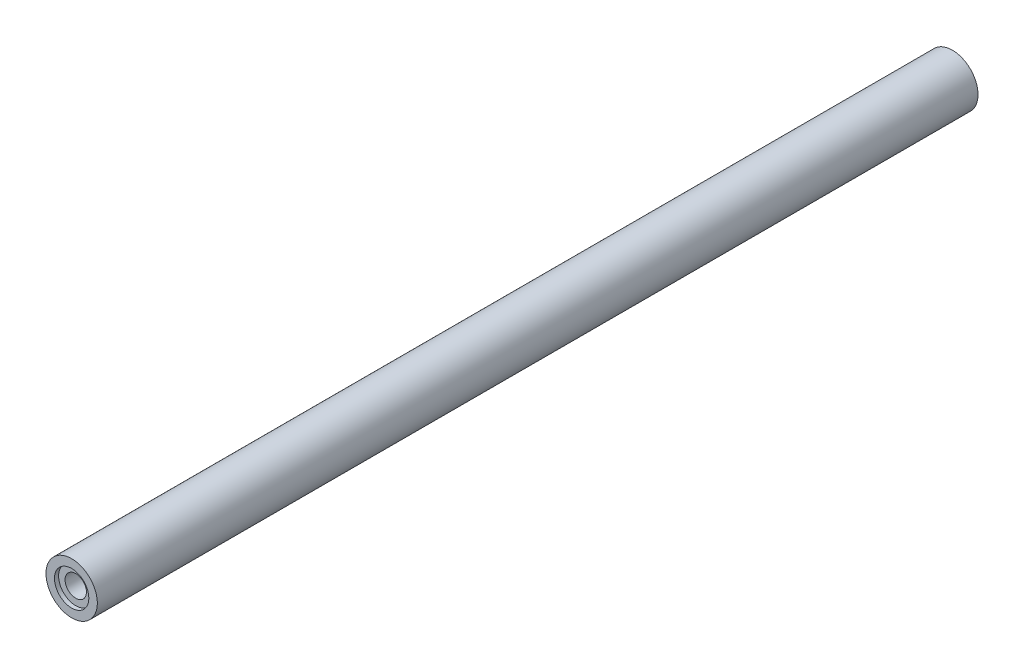
ISO-10303-21;
HEADER;
FILE_DESCRIPTION(('STEP AP214'),'2;1');
FILE_NAME('part.step','',(''),(''),'','','');
FILE_SCHEMA(('AUTOMOTIVE_DESIGN { 1 0 10303 214 1 1 1 1 }'));
ENDSEC;
DATA;
#1=APPLICATION_CONTEXT('core data for automotive mechanical design processes');
#2=APPLICATION_PROTOCOL_DEFINITION('international standard','automotive_design',2000,#1);
#3=PRODUCT_CONTEXT('',#1,'mechanical');
#4=PRODUCT('Part','Part','',(#3));
#5=PRODUCT_RELATED_PRODUCT_CATEGORY('part','',(#4));
#6=PRODUCT_DEFINITION_FORMATION('','',#4);
#7=PRODUCT_DEFINITION_CONTEXT('part definition',#1,'design');
#8=PRODUCT_DEFINITION('design','',#6,#7);
#9=PRODUCT_DEFINITION_SHAPE('','',#8);
#10=(LENGTH_UNIT() NAMED_UNIT(*) SI_UNIT(.MILLI.,.METRE.));
#11=(NAMED_UNIT(*) PLANE_ANGLE_UNIT() SI_UNIT($,.RADIAN.));
#12=(NAMED_UNIT(*) SI_UNIT($,.STERADIAN.) SOLID_ANGLE_UNIT());
#13=UNCERTAINTY_MEASURE_WITH_UNIT(LENGTH_MEASURE(1.E-05),#10,'distance_accuracy_value','');
#14=(GEOMETRIC_REPRESENTATION_CONTEXT(3) GLOBAL_UNCERTAINTY_ASSIGNED_CONTEXT((#13)) GLOBAL_UNIT_ASSIGNED_CONTEXT((#10,
#11,#12)) REPRESENTATION_CONTEXT('',''));
#15=CARTESIAN_POINT('',(0.,0.,0.));
#16=DIRECTION('',(0.,0.,1.));
#17=DIRECTION('',(1.,0.,0.));
#18=AXIS2_PLACEMENT_3D('',#15,#16,#17);
#19=CARTESIAN_POINT('',(0.,0.,327.025));
#20=DIRECTION('',(0.,0.,-1.));
#21=DIRECTION('',(-1.,0.,0.));
#22=AXIS2_PLACEMENT_3D('',#19,#20,#21);
#23=CYLINDRICAL_SURFACE('',#22,9.525);
#24=CARTESIAN_POINT('',(0.,0.,327.025));
#25=DIRECTION('',(0.,0.,1.));
#26=DIRECTION('',(1.,0.,0.));
#27=AXIS2_PLACEMENT_3D('',#24,#25,#26);
#28=CIRCLE('',#27,9.525);
#29=CARTESIAN_POINT('',(-9.525,0.,327.025));
#30=VERTEX_POINT('',#29);
#31=EDGE_CURVE('E13',#30,#30,#28,.T.);
#32=CARTESIAN_POINT('',(0.,0.,0.));
#33=DIRECTION('',(0.,0.,1.));
#34=DIRECTION('',(1.,0.,0.));
#35=AXIS2_PLACEMENT_3D('',#32,#33,#34);
#36=CIRCLE('',#35,9.525);
#37=CARTESIAN_POINT('',(-9.525,0.,0.));
#38=VERTEX_POINT('',#37);
#39=EDGE_CURVE('E51',#38,#38,#36,.T.);
#40=CARTESIAN_POINT('',(-9.525,0.,327.025));
#41=CARTESIAN_POINT('',(-9.525,0.,323.618489583333));
#42=CARTESIAN_POINT('',(-9.525,0.,320.211979166667));
#43=CARTESIAN_POINT('',(-9.525,0.,313.398958333333));
#44=CARTESIAN_POINT('',(-9.525,0.,309.992447916667));
#45=CARTESIAN_POINT('',(-9.525,0.,303.179427083333));
#46=CARTESIAN_POINT('',(-9.525,0.,299.772916666667));
#47=CARTESIAN_POINT('',(-9.525,0.,292.959895833333));
#48=CARTESIAN_POINT('',(-9.525,0.,289.553385416667));
#49=CARTESIAN_POINT('',(-9.525,0.,282.740364583333));
#50=CARTESIAN_POINT('',(-9.525,0.,279.333854166667));
#51=CARTESIAN_POINT('',(-9.525,0.,272.520833333333));
#52=CARTESIAN_POINT('',(-9.525,0.,269.114322916667));
#53=CARTESIAN_POINT('',(-9.525,0.,262.301302083333));
#54=CARTESIAN_POINT('',(-9.525,0.,258.894791666667));
#55=CARTESIAN_POINT('',(-9.525,0.,252.081770833333));
#56=CARTESIAN_POINT('',(-9.525,0.,248.675260416667));
#57=CARTESIAN_POINT('',(-9.525,0.,241.862239583333));
#58=CARTESIAN_POINT('',(-9.525,0.,238.455729166667));
#59=CARTESIAN_POINT('',(-9.525,0.,231.642708333333));
#60=CARTESIAN_POINT('',(-9.525,0.,228.236197916667));
#61=CARTESIAN_POINT('',(-9.525,0.,221.423177083333));
#62=CARTESIAN_POINT('',(-9.525,0.,218.016666666667));
#63=CARTESIAN_POINT('',(-9.525,0.,211.203645833333));
#64=CARTESIAN_POINT('',(-9.525,0.,207.797135416667));
#65=CARTESIAN_POINT('',(-9.525,0.,200.984114583333));
#66=CARTESIAN_POINT('',(-9.525,0.,197.577604166667));
#67=CARTESIAN_POINT('',(-9.525,0.,190.764583333333));
#68=CARTESIAN_POINT('',(-9.525,0.,187.358072916667));
#69=CARTESIAN_POINT('',(-9.525,0.,180.545052083333));
#70=CARTESIAN_POINT('',(-9.525,0.,177.138541666667));
#71=CARTESIAN_POINT('',(-9.525,0.,170.325520833333));
#72=CARTESIAN_POINT('',(-9.525,0.,166.919010416667));
#73=CARTESIAN_POINT('',(-9.525,0.,160.105989583333));
#74=CARTESIAN_POINT('',(-9.525,0.,156.699479166667));
#75=CARTESIAN_POINT('',(-9.525,0.,149.886458333333));
#76=CARTESIAN_POINT('',(-9.525,0.,146.479947916667));
#77=CARTESIAN_POINT('',(-9.525,0.,139.666927083333));
#78=CARTESIAN_POINT('',(-9.525,0.,136.260416666667));
#79=CARTESIAN_POINT('',(-9.525,0.,129.447395833333));
#80=CARTESIAN_POINT('',(-9.525,0.,126.040885416667));
#81=CARTESIAN_POINT('',(-9.525,0.,119.227864583333));
#82=CARTESIAN_POINT('',(-9.525,0.,115.821354166667));
#83=CARTESIAN_POINT('',(-9.525,0.,109.008333333333));
#84=CARTESIAN_POINT('',(-9.525,0.,105.601822916667));
#85=CARTESIAN_POINT('',(-9.525,0.,98.7888020833333));
#86=CARTESIAN_POINT('',(-9.525,0.,95.3822916666666));
#87=CARTESIAN_POINT('',(-9.525,0.,88.5692708333332));
#88=CARTESIAN_POINT('',(-9.525,0.,85.1627604166666));
#89=CARTESIAN_POINT('',(-9.525,0.,78.3497395833333));
#90=CARTESIAN_POINT('',(-9.525,0.,74.9432291666666));
#91=CARTESIAN_POINT('',(-9.525,0.,68.1302083333333));
#92=CARTESIAN_POINT('',(-9.525,0.,64.7236979166666));
#93=CARTESIAN_POINT('',(-9.525,0.,57.9106770833333));
#94=CARTESIAN_POINT('',(-9.525,0.,54.5041666666666));
#95=CARTESIAN_POINT('',(-9.525,0.,47.6911458333333));
#96=CARTESIAN_POINT('',(-9.525,0.,44.2846354166666));
#97=CARTESIAN_POINT('',(-9.525,0.,37.4716145833333));
#98=CARTESIAN_POINT('',(-9.525,0.,34.0651041666666));
#99=CARTESIAN_POINT('',(-9.525,0.,27.2520833333333));
#100=CARTESIAN_POINT('',(-9.525,0.,23.8455729166666));
#101=CARTESIAN_POINT('',(-9.525,0.,17.0325520833333));
#102=CARTESIAN_POINT('',(-9.525,0.,13.6260416666666));
#103=CARTESIAN_POINT('',(-9.525,0.,6.8130208333333));
#104=CARTESIAN_POINT('',(-9.525,0.,3.40651041666663));
#105=CARTESIAN_POINT('',(-9.525,0.,0.));
#106=B_SPLINE_CURVE_WITH_KNOTS('',3,(#40,#41,#42,#43,#44,#45,#46,#47,#48,#49,#50,#51,#52,#53,
#54,#55,#56,#57,#58,#59,#60,#61,#62,#63,#64,#65,#66,#67,#68,#69,#70,#71,#72,#73,#74,#75,#76,#77,
#78,#79,#80,#81,#82,#83,#84,#85,#86,#87,#88,#89,#90,#91,#92,#93,#94,#95,#96,#97,#98,#99,#100,
#101,#102,#103,#104,#105),.UNSPECIFIED.,.F.,.F.,(4,2,2,2,2,2,2,2,2,2,2,2,2,2,2,2,2,2,2,2,2,2,2,
2,2,2,2,2,2,2,2,2,4),(0.,10.21953125,20.4390625,30.65859375,40.878125,51.0976562500001,
61.3171875,71.5367187500001,81.75625,91.9757812500001,102.1953125,112.41484375,122.634375,
132.85390625,143.0734375,153.29296875,163.5125,173.73203125,183.9515625,194.17109375,204.390625,
214.61015625,224.8296875,235.04921875,245.26875,255.48828125,265.7078125,275.92734375,
286.146875,296.36640625,306.5859375,316.80546875,327.025),.UNSPECIFIED.);
#107=EDGE_CURVE('BSEAM48',#30,#38,#106,.T.);
#108=ORIENTED_EDGE('',*,*,#31,.F.);
#109=ORIENTED_EDGE('',*,*,#39,.T.);
#110=ORIENTED_EDGE('',*,*,#107,.T.);
#111=ORIENTED_EDGE('',*,*,#107,.F.);
#112=EDGE_LOOP('',(#108,#110,#109,#111));
#113=FACE_BOUND('',#112,.T.);
#114=ADVANCED_FACE('F48',(#113),#23,.T.);
#115=CARTESIAN_POINT('',(0.,0.,327.025));
#116=DIRECTION('',(0.,0.,1.));
#117=DIRECTION('',(1.,0.,0.));
#118=AXIS2_PLACEMENT_3D('',#115,#116,#117);
#119=PLANE('',#118);
#120=CARTESIAN_POINT('',(0.,0.,327.025));
#121=DIRECTION('',(0.,0.,1.));
#122=DIRECTION('',(1.,0.,0.));
#123=AXIS2_PLACEMENT_3D('',#120,#121,#122);
#124=CIRCLE('',#123,6.3754);
#125=CARTESIAN_POINT('',(6.3754,0.,327.025));
#126=VERTEX_POINT('',#125);
#127=EDGE_CURVE('E88',#126,#126,#124,.T.);
#128=ORIENTED_EDGE('',*,*,#127,.F.);
#129=EDGE_LOOP('',(#128));
#130=FACE_BOUND('',#129,.T.);
#131=ORIENTED_EDGE('',*,*,#31,.T.);
#132=EDGE_LOOP('',(#131));
#133=FACE_BOUND('',#132,.T.);
#134=ADVANCED_FACE('F97',(#130,#133),#119,.T.);
#135=CARTESIAN_POINT('',(0.,0.,0.));
#136=DIRECTION('',(0.,0.,1.));
#137=DIRECTION('',(1.,0.,0.));
#138=AXIS2_PLACEMENT_3D('',#135,#136,#137);
#139=PLANE('',#138);
#140=CARTESIAN_POINT('',(0.,0.,0.));
#141=DIRECTION('',(0.,0.,-1.));
#142=DIRECTION('',(-1.,0.,0.));
#143=AXIS2_PLACEMENT_3D('',#140,#141,#142);
#144=CIRCLE('',#143,6.3754);
#145=CARTESIAN_POINT('',(-6.3754,0.,0.));
#146=VERTEX_POINT('',#145);
#147=EDGE_CURVE('E71',#146,#146,#144,.T.);
#148=ORIENTED_EDGE('',*,*,#147,.F.);
#149=EDGE_LOOP('',(#148));
#150=FACE_BOUND('',#149,.T.);
#151=ORIENTED_EDGE('',*,*,#39,.F.);
#152=EDGE_LOOP('',(#151));
#153=FACE_BOUND('',#152,.T.);
#154=ADVANCED_FACE('F100',(#150,#153),#139,.F.);
#155=CARTESIAN_POINT('',(0.,0.,325.501));
#156=DIRECTION('',(0.,0.,1.));
#157=DIRECTION('',(1.,0.,0.));
#158=AXIS2_PLACEMENT_3D('',#155,#156,#157);
#159=CYLINDRICAL_SURFACE('',#158,6.3754);
#160=CARTESIAN_POINT('',(0.,0.,325.501));
#161=DIRECTION('',(0.,0.,1.));
#162=DIRECTION('',(1.,0.,0.));
#163=AXIS2_PLACEMENT_3D('',#160,#161,#162);
#164=CIRCLE('',#163,6.3754);
#165=CARTESIAN_POINT('',(6.3754,0.,325.501));
#166=VERTEX_POINT('',#165);
#167=EDGE_CURVE('E89',#166,#166,#164,.T.);
#168=CARTESIAN_POINT('',(6.3754,0.,325.501));
#169=CARTESIAN_POINT('',(6.3754,0.,325.516875));
#170=CARTESIAN_POINT('',(6.3754,0.,325.53275));
#171=CARTESIAN_POINT('',(6.3754,0.,325.5645));
#172=CARTESIAN_POINT('',(6.3754,0.,325.580375));
#173=CARTESIAN_POINT('',(6.3754,0.,325.612125));
#174=CARTESIAN_POINT('',(6.3754,0.,325.628));
#175=CARTESIAN_POINT('',(6.3754,0.,325.65975));
#176=CARTESIAN_POINT('',(6.3754,0.,325.675625));
#177=CARTESIAN_POINT('',(6.3754,0.,325.707375));
#178=CARTESIAN_POINT('',(6.3754,0.,325.72325));
#179=CARTESIAN_POINT('',(6.3754,0.,325.755));
#180=CARTESIAN_POINT('',(6.3754,0.,325.770875));
#181=CARTESIAN_POINT('',(6.3754,0.,325.802625));
#182=CARTESIAN_POINT('',(6.3754,0.,325.8185));
#183=CARTESIAN_POINT('',(6.3754,0.,325.85025));
#184=CARTESIAN_POINT('',(6.3754,0.,325.866125));
#185=CARTESIAN_POINT('',(6.3754,0.,325.897875));
#186=CARTESIAN_POINT('',(6.3754,0.,325.91375));
#187=CARTESIAN_POINT('',(6.3754,0.,325.9455));
#188=CARTESIAN_POINT('',(6.3754,0.,325.961375));
#189=CARTESIAN_POINT('',(6.3754,0.,325.993125));
#190=CARTESIAN_POINT('',(6.3754,0.,326.009));
#191=CARTESIAN_POINT('',(6.3754,0.,326.04075));
#192=CARTESIAN_POINT('',(6.3754,0.,326.056625));
#193=CARTESIAN_POINT('',(6.3754,0.,326.088375));
#194=CARTESIAN_POINT('',(6.3754,0.,326.10425));
#195=CARTESIAN_POINT('',(6.3754,0.,326.136));
#196=CARTESIAN_POINT('',(6.3754,0.,326.151875));
#197=CARTESIAN_POINT('',(6.3754,0.,326.183625));
#198=CARTESIAN_POINT('',(6.3754,0.,326.1995));
#199=CARTESIAN_POINT('',(6.3754,0.,326.23125));
#200=CARTESIAN_POINT('',(6.3754,0.,326.247125));
#201=CARTESIAN_POINT('',(6.3754,0.,326.278875));
#202=CARTESIAN_POINT('',(6.3754,0.,326.29475));
#203=CARTESIAN_POINT('',(6.3754,0.,326.3265));
#204=CARTESIAN_POINT('',(6.3754,0.,326.342375));
#205=CARTESIAN_POINT('',(6.3754,0.,326.374125));
#206=CARTESIAN_POINT('',(6.3754,0.,326.39));
#207=CARTESIAN_POINT('',(6.3754,0.,326.42175));
#208=CARTESIAN_POINT('',(6.3754,0.,326.437625));
#209=CARTESIAN_POINT('',(6.3754,0.,326.469375));
#210=CARTESIAN_POINT('',(6.3754,0.,326.48525));
#211=CARTESIAN_POINT('',(6.3754,0.,326.517));
#212=CARTESIAN_POINT('',(6.3754,0.,326.532875));
#213=CARTESIAN_POINT('',(6.3754,0.,326.564625));
#214=CARTESIAN_POINT('',(6.3754,0.,326.5805));
#215=CARTESIAN_POINT('',(6.3754,0.,326.61225));
#216=CARTESIAN_POINT('',(6.3754,0.,326.628125));
#217=CARTESIAN_POINT('',(6.3754,0.,326.659875));
#218=CARTESIAN_POINT('',(6.3754,0.,326.67575));
#219=CARTESIAN_POINT('',(6.3754,0.,326.7075));
#220=CARTESIAN_POINT('',(6.3754,0.,326.723375));
#221=CARTESIAN_POINT('',(6.3754,0.,326.755125));
#222=CARTESIAN_POINT('',(6.3754,0.,326.771));
#223=CARTESIAN_POINT('',(6.3754,0.,326.80275));
#224=CARTESIAN_POINT('',(6.3754,0.,326.818625));
#225=CARTESIAN_POINT('',(6.3754,0.,326.850375));
#226=CARTESIAN_POINT('',(6.3754,0.,326.86625));
#227=CARTESIAN_POINT('',(6.3754,0.,326.898));
#228=CARTESIAN_POINT('',(6.3754,0.,326.913875));
#229=CARTESIAN_POINT('',(6.3754,0.,326.945625));
#230=CARTESIAN_POINT('',(6.3754,0.,326.9615));
#231=CARTESIAN_POINT('',(6.3754,0.,326.99325));
#232=CARTESIAN_POINT('',(6.3754,0.,327.009125));
#233=CARTESIAN_POINT('',(6.3754,0.,327.025));
#234=B_SPLINE_CURVE_WITH_KNOTS('',3,(#168,#169,#170,#171,#172,#173,#174,#175,#176,#177,#178,
#179,#180,#181,#182,#183,#184,#185,#186,#187,#188,#189,#190,#191,#192,#193,#194,#195,#196,#197,
#198,#199,#200,#201,#202,#203,#204,#205,#206,#207,#208,#209,#210,#211,#212,#213,#214,#215,#216,
#217,#218,#219,#220,#221,#222,#223,#224,#225,#226,#227,#228,#229,#230,#231,#232,#233),
.UNSPECIFIED.,.F.,.F.,(4,2,2,2,2,2,2,2,2,2,2,2,2,2,2,2,2,2,2,2,2,2,2,2,2,2,2,2,2,2,2,2,4),(0.,
0.0476250000000511,0.0952500000000467,0.142875000000042,0.190500000000038,0.238125000000033,
0.285750000000029,0.333375000000025,0.38100000000002,0.428625000000016,0.476250000000011,
0.523875000000062,0.571500000000058,0.619125000000054,0.666750000000049,0.714375000000045,
0.76200000000004,0.809625000000036,0.857250000000032,0.904875000000027,0.952500000000023,
1.00012500000002,1.04775000000007,1.09537500000007,1.14300000000006,1.19062500000006,
1.23825000000005,1.28587500000005,1.33350000000004,1.38112500000004,1.42875000000003,
1.47637500000003,1.52400000000003),.UNSPECIFIED.);
#235=EDGE_CURVE('BSEAM95',#166,#126,#234,.T.);
#236=ORIENTED_EDGE('',*,*,#167,.F.);
#237=ORIENTED_EDGE('',*,*,#127,.T.);
#238=ORIENTED_EDGE('',*,*,#235,.T.);
#239=ORIENTED_EDGE('',*,*,#235,.F.);
#240=EDGE_LOOP('',(#236,#238,#237,#239));
#241=FACE_BOUND('',#240,.T.);
#242=ADVANCED_FACE('F95',(#241),#159,.F.);
#243=CARTESIAN_POINT('',(0.,0.,325.501));
#244=DIRECTION('',(0.,0.,1.));
#245=DIRECTION('',(1.,0.,0.));
#246=AXIS2_PLACEMENT_3D('',#243,#244,#245);
#247=PLANE('',#246);
#248=CARTESIAN_POINT('',(0.,0.,325.501));
#249=DIRECTION('',(0.,0.,1.));
#250=DIRECTION('',(1.,0.,0.));
#251=AXIS2_PLACEMENT_3D('',#248,#249,#250);
#252=CIRCLE('',#251,3.96874999999999);
#253=CARTESIAN_POINT('',(3.96874999999999,0.,325.501));
#254=VERTEX_POINT('',#253);
#255=EDGE_CURVE('E81',#254,#254,#252,.T.);
#256=ORIENTED_EDGE('',*,*,#255,.F.);
#257=EDGE_LOOP('',(#256));
#258=FACE_BOUND('',#257,.T.);
#259=ORIENTED_EDGE('',*,*,#167,.T.);
#260=EDGE_LOOP('',(#259));
#261=FACE_BOUND('',#260,.T.);
#262=ADVANCED_FACE('F114',(#258,#261),#247,.T.);
#263=CARTESIAN_POINT('',(0.,0.,300.101));
#264=DIRECTION('',(0.,0.,1.));
#265=DIRECTION('',(1.,0.,0.));
#266=AXIS2_PLACEMENT_3D('',#263,#264,#265);
#267=CONICAL_SURFACE('',#266,3.96874999999999,1.02974425867665);
#268=CARTESIAN_POINT('',(0.,0.,297.716334418234));
#269=VERTEX_POINT('',#268);
#270=VERTEX_LOOP('',#269);
#271=FACE_BOUND('',#270,.T.);
#272=CARTESIAN_POINT('',(0.,0.,300.101));
#273=DIRECTION('',(0.,0.,1.));
#274=DIRECTION('',(1.,0.,0.));
#275=AXIS2_PLACEMENT_3D('',#272,#273,#274);
#276=CIRCLE('',#275,3.96874999999999);
#277=CARTESIAN_POINT('',(3.96874999999999,0.,300.101));
#278=VERTEX_POINT('',#277);
#279=EDGE_CURVE('E85',#278,#278,#276,.T.);
#280=ORIENTED_EDGE('',*,*,#279,.T.);
#281=EDGE_LOOP('',(#280));
#282=FACE_BOUND('',#281,.T.);
#283=ADVANCED_FACE('F121',(#271,#282),#267,.F.);
#284=CARTESIAN_POINT('',(0.,0.,325.501));
#285=DIRECTION('',(0.,0.,1.));
#286=DIRECTION('',(1.,0.,0.));
#287=AXIS2_PLACEMENT_3D('',#284,#285,#286);
#288=CYLINDRICAL_SURFACE('',#287,3.96874999999999);
#289=ORIENTED_EDGE('',*,*,#279,.F.);
#290=EDGE_LOOP('',(#289));
#291=FACE_BOUND('',#290,.T.);
#292=ORIENTED_EDGE('',*,*,#255,.T.);
#293=EDGE_LOOP('',(#292));
#294=FACE_BOUND('',#293,.T.);
#295=ADVANCED_FACE('F125',(#291,#294),#288,.F.);
#296=CARTESIAN_POINT('',(0.,0.,1.524));
#297=DIRECTION('',(0.,0.,-1.));
#298=DIRECTION('',(-1.,0.,0.));
#299=AXIS2_PLACEMENT_3D('',#296,#297,#298);
#300=CYLINDRICAL_SURFACE('',#299,6.3754);
#301=CARTESIAN_POINT('',(0.,0.,1.524));
#302=DIRECTION('',(0.,0.,-1.));
#303=DIRECTION('',(-1.,0.,0.));
#304=AXIS2_PLACEMENT_3D('',#301,#302,#303);
#305=CIRCLE('',#304,6.3754);
#306=CARTESIAN_POINT('',(-6.3754,0.,1.524));
#307=VERTEX_POINT('',#306);
#308=EDGE_CURVE('E75',#307,#307,#305,.T.);
#309=CARTESIAN_POINT('',(-6.3754,0.,1.524));
#310=CARTESIAN_POINT('',(-6.3754,0.,1.508125));
#311=CARTESIAN_POINT('',(-6.3754,0.,1.49225));
#312=CARTESIAN_POINT('',(-6.3754,0.,1.4605));
#313=CARTESIAN_POINT('',(-6.3754,0.,1.444625));
#314=CARTESIAN_POINT('',(-6.3754,0.,1.412875));
#315=CARTESIAN_POINT('',(-6.3754,0.,1.397));
#316=CARTESIAN_POINT('',(-6.3754,0.,1.36525));
#317=CARTESIAN_POINT('',(-6.3754,0.,1.349375));
#318=CARTESIAN_POINT('',(-6.3754,0.,1.317625));
#319=CARTESIAN_POINT('',(-6.3754,0.,1.30175));
#320=CARTESIAN_POINT('',(-6.3754,0.,1.27));
#321=CARTESIAN_POINT('',(-6.3754,0.,1.254125));
#322=CARTESIAN_POINT('',(-6.3754,0.,1.222375));
#323=CARTESIAN_POINT('',(-6.3754,0.,1.2065));
#324=CARTESIAN_POINT('',(-6.3754,0.,1.17475));
#325=CARTESIAN_POINT('',(-6.3754,0.,1.158875));
#326=CARTESIAN_POINT('',(-6.3754,0.,1.127125));
#327=CARTESIAN_POINT('',(-6.3754,0.,1.11125));
#328=CARTESIAN_POINT('',(-6.3754,0.,1.0795));
#329=CARTESIAN_POINT('',(-6.3754,0.,1.063625));
#330=CARTESIAN_POINT('',(-6.3754,0.,1.031875));
#331=CARTESIAN_POINT('',(-6.3754,0.,1.016));
#332=CARTESIAN_POINT('',(-6.3754,0.,0.98425));
#333=CARTESIAN_POINT('',(-6.3754,0.,0.968375));
#334=CARTESIAN_POINT('',(-6.3754,0.,0.936625));
#335=CARTESIAN_POINT('',(-6.3754,0.,0.92075));
#336=CARTESIAN_POINT('',(-6.3754,0.,0.889));
#337=CARTESIAN_POINT('',(-6.3754,0.,0.873125));
#338=CARTESIAN_POINT('',(-6.3754,0.,0.841375));
#339=CARTESIAN_POINT('',(-6.3754,0.,0.8255));
#340=CARTESIAN_POINT('',(-6.3754,0.,0.79375));
#341=CARTESIAN_POINT('',(-6.3754,0.,0.777875));
#342=CARTESIAN_POINT('',(-6.3754,0.,0.746125));
#343=CARTESIAN_POINT('',(-6.3754,0.,0.73025));
#344=CARTESIAN_POINT('',(-6.3754,0.,0.6985));
#345=CARTESIAN_POINT('',(-6.3754,0.,0.682625));
#346=CARTESIAN_POINT('',(-6.3754,0.,0.650875));
#347=CARTESIAN_POINT('',(-6.3754,0.,0.635));
#348=CARTESIAN_POINT('',(-6.3754,0.,0.60325));
#349=CARTESIAN_POINT('',(-6.3754,0.,0.587375));
#350=CARTESIAN_POINT('',(-6.3754,0.,0.555625));
#351=CARTESIAN_POINT('',(-6.3754,0.,0.53975));
#352=CARTESIAN_POINT('',(-6.3754,0.,0.508));
#353=CARTESIAN_POINT('',(-6.3754,0.,0.492125));
#354=CARTESIAN_POINT('',(-6.3754,0.,0.460375));
#355=CARTESIAN_POINT('',(-6.3754,0.,0.4445));
#356=CARTESIAN_POINT('',(-6.3754,0.,0.41275));
#357=CARTESIAN_POINT('',(-6.3754,0.,0.396875));
#358=CARTESIAN_POINT('',(-6.3754,0.,0.365125));
#359=CARTESIAN_POINT('',(-6.3754,0.,0.34925));
#360=CARTESIAN_POINT('',(-6.3754,0.,0.3175));
#361=CARTESIAN_POINT('',(-6.3754,0.,0.301625));
#362=CARTESIAN_POINT('',(-6.3754,0.,0.269875));
#363=CARTESIAN_POINT('',(-6.3754,0.,0.254));
#364=CARTESIAN_POINT('',(-6.3754,0.,0.22225));
#365=CARTESIAN_POINT('',(-6.3754,0.,0.206375));
#366=CARTESIAN_POINT('',(-6.3754,0.,0.174625));
#367=CARTESIAN_POINT('',(-6.3754,0.,0.15875));
#368=CARTESIAN_POINT('',(-6.3754,0.,0.127));
#369=CARTESIAN_POINT('',(-6.3754,0.,0.111125));
#370=CARTESIAN_POINT('',(-6.3754,0.,0.079375));
#371=CARTESIAN_POINT('',(-6.3754,0.,0.0635));
#372=CARTESIAN_POINT('',(-6.3754,0.,0.0317499999999999));
#373=CARTESIAN_POINT('',(-6.3754,0.,0.015875));
#374=CARTESIAN_POINT('',(-6.3754,0.,0.));
#375=B_SPLINE_CURVE_WITH_KNOTS('',3,(#309,#310,#311,#312,#313,#314,#315,#316,#317,#318,#319,
#320,#321,#322,#323,#324,#325,#326,#327,#328,#329,#330,#331,#332,#333,#334,#335,#336,#337,#338,
#339,#340,#341,#342,#343,#344,#345,#346,#347,#348,#349,#350,#351,#352,#353,#354,#355,#356,#357,
#358,#359,#360,#361,#362,#363,#364,#365,#366,#367,#368,#369,#370,#371,#372,#373,#374),
.UNSPECIFIED.,.F.,.F.,(4,2,2,2,2,2,2,2,2,2,2,2,2,2,2,2,2,2,2,2,2,2,2,2,2,2,2,2,2,2,2,2,4),(0.,
0.0476249999999999,0.0952499999999998,0.142875,0.1905,0.238125,0.28575,0.333375,0.381,0.428625,
0.47625,0.523875,0.5715,0.619125,0.66675,0.714375,0.762,0.809625,0.85725,0.904875,0.9525,
1.000125,1.04775,1.095375,1.143,1.190625,1.23825,1.285875,1.3335,1.381125,1.42875,1.476375,
1.524),.UNSPECIFIED.);
#376=EDGE_CURVE('BSEAM128',#307,#146,#375,.T.);
#377=ORIENTED_EDGE('',*,*,#308,.F.);
#378=ORIENTED_EDGE('',*,*,#147,.T.);
#379=ORIENTED_EDGE('',*,*,#376,.T.);
#380=ORIENTED_EDGE('',*,*,#376,.F.);
#381=EDGE_LOOP('',(#377,#379,#378,#380));
#382=FACE_BOUND('',#381,.T.);
#383=ADVANCED_FACE('F128',(#382),#300,.F.);
#384=CARTESIAN_POINT('',(0.,0.,1.524));
#385=DIRECTION('',(0.,0.,-1.));
#386=DIRECTION('',(-1.,0.,0.));
#387=AXIS2_PLACEMENT_3D('',#384,#385,#386);
#388=PLANE('',#387);
#389=CARTESIAN_POINT('',(0.,0.,1.524));
#390=DIRECTION('',(0.,0.,-1.));
#391=DIRECTION('',(-1.,0.,0.));
#392=AXIS2_PLACEMENT_3D('',#389,#390,#391);
#393=CIRCLE('',#392,3.96874999999999);
#394=CARTESIAN_POINT('',(-3.96874999999999,0.,1.524));
#395=VERTEX_POINT('',#394);
#396=EDGE_CURVE('E72',#395,#395,#393,.T.);
#397=ORIENTED_EDGE('',*,*,#396,.F.);
#398=EDGE_LOOP('',(#397));
#399=FACE_BOUND('',#398,.T.);
#400=ORIENTED_EDGE('',*,*,#308,.T.);
#401=EDGE_LOOP('',(#400));
#402=FACE_BOUND('',#401,.T.);
#403=ADVANCED_FACE('F65',(#399,#402),#388,.T.);
#404=CARTESIAN_POINT('',(0.,0.,26.924));
#405=DIRECTION('',(0.,0.,-1.));
#406=DIRECTION('',(-1.,0.,0.));
#407=AXIS2_PLACEMENT_3D('',#404,#405,#406);
#408=CONICAL_SURFACE('',#407,3.96874999999999,1.02974425867665);
#409=CARTESIAN_POINT('',(0.,0.,29.3086655817656));
#410=VERTEX_POINT('',#409);
#411=VERTEX_LOOP('',#410);
#412=FACE_BOUND('',#411,.T.);
#413=CARTESIAN_POINT('',(0.,0.,26.924));
#414=DIRECTION('',(0.,0.,-1.));
#415=DIRECTION('',(-1.,0.,0.));
#416=AXIS2_PLACEMENT_3D('',#413,#414,#415);
#417=CIRCLE('',#416,3.96874999999999);
#418=CARTESIAN_POINT('',(-3.96874999999999,0.,26.924));
#419=VERTEX_POINT('',#418);
#420=EDGE_CURVE('E69',#419,#419,#417,.T.);
#421=ORIENTED_EDGE('',*,*,#420,.T.);
#422=EDGE_LOOP('',(#421));
#423=FACE_BOUND('',#422,.T.);
#424=ADVANCED_FACE('F61',(#412,#423),#408,.F.);
#425=CARTESIAN_POINT('',(0.,0.,1.524));
#426=DIRECTION('',(0.,0.,-1.));
#427=DIRECTION('',(-1.,0.,0.));
#428=AXIS2_PLACEMENT_3D('',#425,#426,#427);
#429=CYLINDRICAL_SURFACE('',#428,3.96874999999999);
#430=ORIENTED_EDGE('',*,*,#420,.F.);
#431=EDGE_LOOP('',(#430));
#432=FACE_BOUND('',#431,.T.);
#433=ORIENTED_EDGE('',*,*,#396,.T.);
#434=EDGE_LOOP('',(#433));
#435=FACE_BOUND('',#434,.T.);
#436=ADVANCED_FACE('F64',(#432,#435),#429,.F.);
#437=CLOSED_SHELL('',(#114,#134,#154,#242,#262,#283,#295,#383,#403,#424,#436));
#438=MANIFOLD_SOLID_BREP('B2',#437);
#439=ADVANCED_BREP_SHAPE_REPRESENTATION('',(#18,#438),#14);
#440=SHAPE_DEFINITION_REPRESENTATION(#9,#439);
ENDSEC;
END-ISO-10303-21;
